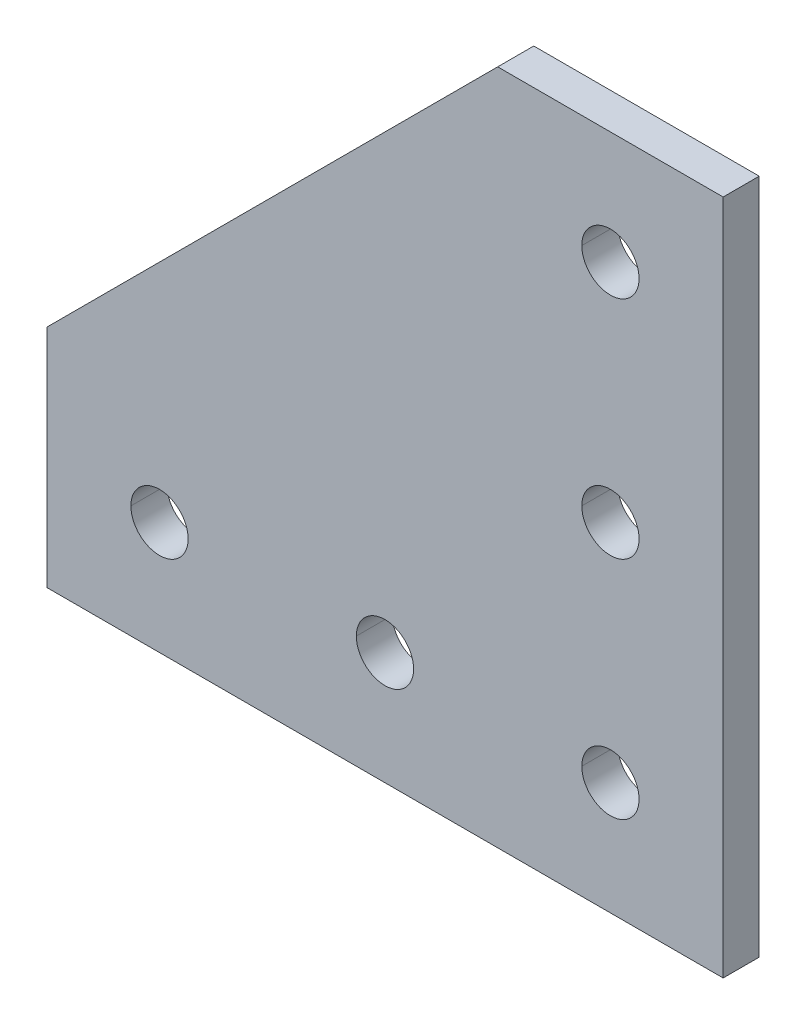
ISO-10303-21;
HEADER;
FILE_DESCRIPTION(('STEP AP214'),'2;1');
FILE_NAME('part.step','',(''),(''),'','','');
FILE_SCHEMA(('AUTOMOTIVE_DESIGN { 1 0 10303 214 1 1 1 1 }'));
ENDSEC;
DATA;
#1=APPLICATION_CONTEXT('core data for automotive mechanical design processes');
#2=APPLICATION_PROTOCOL_DEFINITION('international standard','automotive_design',2000,#1);
#3=PRODUCT_CONTEXT('',#1,'mechanical');
#4=PRODUCT('Part','Part','',(#3));
#5=PRODUCT_RELATED_PRODUCT_CATEGORY('part','',(#4));
#6=PRODUCT_DEFINITION_FORMATION('','',#4);
#7=PRODUCT_DEFINITION_CONTEXT('part definition',#1,'design');
#8=PRODUCT_DEFINITION('design','',#6,#7);
#9=PRODUCT_DEFINITION_SHAPE('','',#8);
#10=(LENGTH_UNIT() NAMED_UNIT(*) SI_UNIT(.MILLI.,.METRE.));
#11=(NAMED_UNIT(*) PLANE_ANGLE_UNIT() SI_UNIT($,.RADIAN.));
#12=(NAMED_UNIT(*) SI_UNIT($,.STERADIAN.) SOLID_ANGLE_UNIT());
#13=UNCERTAINTY_MEASURE_WITH_UNIT(LENGTH_MEASURE(1.E-05),#10,'distance_accuracy_value','');
#14=(GEOMETRIC_REPRESENTATION_CONTEXT(3) GLOBAL_UNCERTAINTY_ASSIGNED_CONTEXT((#13)) GLOBAL_UNIT_ASSIGNED_CONTEXT((#10,
#11,#12)) REPRESENTATION_CONTEXT('',''));
#15=CARTESIAN_POINT('',(0.,0.,0.));
#16=DIRECTION('',(0.,0.,1.));
#17=DIRECTION('',(1.,0.,0.));
#18=AXIS2_PLACEMENT_3D('',#15,#16,#17);
#19=CARTESIAN_POINT('',(37.5,75.,4.));
#20=DIRECTION('',(0.,-1.,0.));
#21=DIRECTION('',(0.,0.,-1.));
#22=AXIS2_PLACEMENT_3D('',#19,#20,#21);
#23=PLANE('',#22);
#24=DIRECTION('',(-1.,0.,0.));
#25=VECTOR('',#24,1.);
#26=CARTESIAN_POINT('',(37.5,75.,0.));
#27=LINE('',#26,#25);
#28=CARTESIAN_POINT('',(37.5,75.,0.));
#29=VERTEX_POINT('',#28);
#30=CARTESIAN_POINT('',(12.5,75.,0.));
#31=VERTEX_POINT('',#30);
#32=EDGE_CURVE('E11',#29,#31,#27,.T.);
#33=ORIENTED_EDGE('',*,*,#32,.T.);
#34=DIRECTION('',(0.,0.,-1.));
#35=VECTOR('',#34,1.);
#36=CARTESIAN_POINT('',(12.5,75.,4.));
#37=LINE('',#36,#35);
#38=CARTESIAN_POINT('',(12.5,75.,4.));
#39=VERTEX_POINT('',#38);
#40=EDGE_CURVE('E25',#39,#31,#37,.T.);
#41=ORIENTED_EDGE('',*,*,#40,.F.);
#42=DIRECTION('',(-1.,0.,0.));
#43=VECTOR('',#42,1.);
#44=CARTESIAN_POINT('',(37.5,75.,4.));
#45=LINE('',#44,#43);
#46=CARTESIAN_POINT('',(37.5,75.,4.));
#47=VERTEX_POINT('',#46);
#48=EDGE_CURVE('E290',#47,#39,#45,.T.);
#49=ORIENTED_EDGE('',*,*,#48,.F.);
#50=DIRECTION('',(0.,0.,-1.));
#51=VECTOR('',#50,1.);
#52=CARTESIAN_POINT('',(37.5,75.,4.));
#53=LINE('',#52,#51);
#54=EDGE_CURVE('E286',#47,#29,#53,.T.);
#55=ORIENTED_EDGE('',*,*,#54,.T.);
#56=EDGE_LOOP('',(#33,#41,#49,#55));
#57=FACE_BOUND('',#56,.T.);
#58=ADVANCED_FACE('F17',(#57),#23,.F.);
#59=CARTESIAN_POINT('',(37.5,0.,4.));
#60=DIRECTION('',(-1.,0.,0.));
#61=DIRECTION('',(0.,0.,1.));
#62=AXIS2_PLACEMENT_3D('',#59,#60,#61);
#63=PLANE('',#62);
#64=DIRECTION('',(0.,1.,0.));
#65=VECTOR('',#64,1.);
#66=CARTESIAN_POINT('',(37.5,0.,0.));
#67=LINE('',#66,#65);
#68=CARTESIAN_POINT('',(37.5,0.,0.));
#69=VERTEX_POINT('',#68);
#70=EDGE_CURVE('E281',#69,#29,#67,.T.);
#71=ORIENTED_EDGE('',*,*,#70,.T.);
#72=ORIENTED_EDGE('',*,*,#54,.F.);
#73=DIRECTION('',(0.,1.,0.));
#74=VECTOR('',#73,1.);
#75=CARTESIAN_POINT('',(37.5,0.,4.));
#76=LINE('',#75,#74);
#77=CARTESIAN_POINT('',(37.5,0.,4.));
#78=VERTEX_POINT('',#77);
#79=EDGE_CURVE('E276',#78,#47,#76,.T.);
#80=ORIENTED_EDGE('',*,*,#79,.F.);
#81=DIRECTION('',(0.,0.,-1.));
#82=VECTOR('',#81,1.);
#83=CARTESIAN_POINT('',(37.5,0.,4.));
#84=LINE('',#83,#82);
#85=EDGE_CURVE('E272',#78,#69,#84,.T.);
#86=ORIENTED_EDGE('',*,*,#85,.T.);
#87=EDGE_LOOP('',(#71,#72,#80,#86));
#88=FACE_BOUND('',#87,.T.);
#89=ADVANCED_FACE('F314',(#88),#63,.F.);
#90=CARTESIAN_POINT('',(-37.5,0.,4.));
#91=DIRECTION('',(0.,1.,0.));
#92=DIRECTION('',(0.,0.,1.));
#93=AXIS2_PLACEMENT_3D('',#90,#91,#92);
#94=PLANE('',#93);
#95=DIRECTION('',(1.,0.,0.));
#96=VECTOR('',#95,1.);
#97=CARTESIAN_POINT('',(-37.5,0.,0.));
#98=LINE('',#97,#96);
#99=CARTESIAN_POINT('',(-37.5,0.,0.));
#100=VERTEX_POINT('',#99);
#101=EDGE_CURVE('E267',#100,#69,#98,.T.);
#102=ORIENTED_EDGE('',*,*,#101,.T.);
#103=ORIENTED_EDGE('',*,*,#85,.F.);
#104=DIRECTION('',(1.,0.,0.));
#105=VECTOR('',#104,1.);
#106=CARTESIAN_POINT('',(-37.5,0.,4.));
#107=LINE('',#106,#105);
#108=CARTESIAN_POINT('',(-37.5,0.,4.));
#109=VERTEX_POINT('',#108);
#110=EDGE_CURVE('E262',#109,#78,#107,.T.);
#111=ORIENTED_EDGE('',*,*,#110,.F.);
#112=DIRECTION('',(0.,0.,-1.));
#113=VECTOR('',#112,1.);
#114=CARTESIAN_POINT('',(-37.5,0.,4.));
#115=LINE('',#114,#113);
#116=EDGE_CURVE('E258',#109,#100,#115,.T.);
#117=ORIENTED_EDGE('',*,*,#116,.T.);
#118=EDGE_LOOP('',(#102,#103,#111,#117));
#119=FACE_BOUND('',#118,.T.);
#120=ADVANCED_FACE('F317',(#119),#94,.F.);
#121=CARTESIAN_POINT('',(-37.5,25.,4.));
#122=DIRECTION('',(1.,0.,0.));
#123=DIRECTION('',(0.,0.,-1.));
#124=AXIS2_PLACEMENT_3D('',#121,#122,#123);
#125=PLANE('',#124);
#126=DIRECTION('',(0.,-1.,0.));
#127=VECTOR('',#126,1.);
#128=CARTESIAN_POINT('',(-37.5,25.,0.));
#129=LINE('',#128,#127);
#130=CARTESIAN_POINT('',(-37.5,25.,0.));
#131=VERTEX_POINT('',#130);
#132=EDGE_CURVE('E253',#131,#100,#129,.T.);
#133=ORIENTED_EDGE('',*,*,#132,.T.);
#134=ORIENTED_EDGE('',*,*,#116,.F.);
#135=DIRECTION('',(0.,-1.,0.));
#136=VECTOR('',#135,1.);
#137=CARTESIAN_POINT('',(-37.5,25.,4.));
#138=LINE('',#137,#136);
#139=CARTESIAN_POINT('',(-37.5,25.,4.));
#140=VERTEX_POINT('',#139);
#141=EDGE_CURVE('E248',#140,#109,#138,.T.);
#142=ORIENTED_EDGE('',*,*,#141,.F.);
#143=DIRECTION('',(0.,0.,-1.));
#144=VECTOR('',#143,1.);
#145=CARTESIAN_POINT('',(-37.5,25.,4.));
#146=LINE('',#145,#144);
#147=EDGE_CURVE('E244',#140,#131,#146,.T.);
#148=ORIENTED_EDGE('',*,*,#147,.T.);
#149=EDGE_LOOP('',(#133,#134,#142,#148));
#150=FACE_BOUND('',#149,.T.);
#151=ADVANCED_FACE('F309',(#150),#125,.F.);
#152=CARTESIAN_POINT('',(12.5,75.,4.));
#153=DIRECTION('',(0.707106781186547,-0.707106781186548,0.));
#154=DIRECTION('',(0.707106781186548,0.707106781186547,0.));
#155=AXIS2_PLACEMENT_3D('',#152,#153,#154);
#156=PLANE('',#155);
#157=DIRECTION('',(-0.707106781186548,-0.707106781186547,0.));
#158=VECTOR('',#157,1.);
#159=CARTESIAN_POINT('',(12.5,75.,0.));
#160=LINE('',#159,#158);
#161=EDGE_CURVE('E239',#31,#131,#160,.T.);
#162=ORIENTED_EDGE('',*,*,#161,.T.);
#163=ORIENTED_EDGE('',*,*,#147,.F.);
#164=DIRECTION('',(-0.707106781186548,-0.707106781186547,0.));
#165=VECTOR('',#164,1.);
#166=CARTESIAN_POINT('',(12.5,75.,4.));
#167=LINE('',#166,#165);
#168=EDGE_CURVE('E234',#39,#140,#167,.T.);
#169=ORIENTED_EDGE('',*,*,#168,.F.);
#170=ORIENTED_EDGE('',*,*,#40,.T.);
#171=EDGE_LOOP('',(#162,#163,#169,#170));
#172=FACE_BOUND('',#171,.T.);
#173=ADVANCED_FACE('F301',(#172),#156,.F.);
#174=CARTESIAN_POINT('',(0.,0.,4.));
#175=DIRECTION('',(0.,0.,1.));
#176=DIRECTION('',(1.,0.,0.));
#177=AXIS2_PLACEMENT_3D('',#174,#175,#176);
#178=PLANE('',#177);
#179=CARTESIAN_POINT('',(-25.,12.5,4.));
#180=DIRECTION('',(0.,0.,1.));
#181=DIRECTION('',(1.,0.,0.));
#182=AXIS2_PLACEMENT_3D('',#179,#180,#181);
#183=CIRCLE('',#182,3.175);
#184=CARTESIAN_POINT('',(-21.825,12.5,4.));
#185=VERTEX_POINT('',#184);
#186=CARTESIAN_POINT('',(-28.175,12.5,4.));
#187=VERTEX_POINT('',#186);
#188=EDGE_CURVE('E229',#185,#187,#183,.T.);
#189=ORIENTED_EDGE('',*,*,#188,.F.);
#190=CARTESIAN_POINT('',(-25.,12.5,4.));
#191=DIRECTION('',(0.,0.,1.));
#192=DIRECTION('',(1.,0.,0.));
#193=AXIS2_PLACEMENT_3D('',#190,#191,#192);
#194=CIRCLE('',#193,3.175);
#195=EDGE_CURVE('E224',#187,#185,#194,.T.);
#196=ORIENTED_EDGE('',*,*,#195,.F.);
#197=EDGE_LOOP('',(#189,#196));
#198=FACE_BOUND('',#197,.T.);
#199=CARTESIAN_POINT('',(0.,12.5,4.));
#200=DIRECTION('',(0.,0.,1.));
#201=DIRECTION('',(1.,0.,0.));
#202=AXIS2_PLACEMENT_3D('',#199,#200,#201);
#203=CIRCLE('',#202,3.175);
#204=CARTESIAN_POINT('',(3.175,12.5,4.));
#205=VERTEX_POINT('',#204);
#206=CARTESIAN_POINT('',(-3.175,12.5,4.));
#207=VERTEX_POINT('',#206);
#208=EDGE_CURVE('E219',#205,#207,#203,.T.);
#209=ORIENTED_EDGE('',*,*,#208,.F.);
#210=CARTESIAN_POINT('',(0.,12.5,4.));
#211=DIRECTION('',(0.,0.,1.));
#212=DIRECTION('',(1.,0.,0.));
#213=AXIS2_PLACEMENT_3D('',#210,#211,#212);
#214=CIRCLE('',#213,3.175);
#215=EDGE_CURVE('E214',#207,#205,#214,.T.);
#216=ORIENTED_EDGE('',*,*,#215,.F.);
#217=EDGE_LOOP('',(#209,#216));
#218=FACE_BOUND('',#217,.T.);
#219=CARTESIAN_POINT('',(25.,62.5,4.));
#220=DIRECTION('',(0.,0.,1.));
#221=DIRECTION('',(1.,0.,0.));
#222=AXIS2_PLACEMENT_3D('',#219,#220,#221);
#223=CIRCLE('',#222,3.175);
#224=CARTESIAN_POINT('',(28.175,62.5,4.));
#225=VERTEX_POINT('',#224);
#226=CARTESIAN_POINT('',(21.825,62.5,4.));
#227=VERTEX_POINT('',#226);
#228=EDGE_CURVE('E209',#225,#227,#223,.T.);
#229=ORIENTED_EDGE('',*,*,#228,.F.);
#230=CARTESIAN_POINT('',(25.,62.5,4.));
#231=DIRECTION('',(0.,0.,1.));
#232=DIRECTION('',(1.,0.,0.));
#233=AXIS2_PLACEMENT_3D('',#230,#231,#232);
#234=CIRCLE('',#233,3.175);
#235=EDGE_CURVE('E204',#227,#225,#234,.T.);
#236=ORIENTED_EDGE('',*,*,#235,.F.);
#237=EDGE_LOOP('',(#229,#236));
#238=FACE_BOUND('',#237,.T.);
#239=CARTESIAN_POINT('',(25.,37.5,4.));
#240=DIRECTION('',(0.,0.,1.));
#241=DIRECTION('',(1.,0.,0.));
#242=AXIS2_PLACEMENT_3D('',#239,#240,#241);
#243=CIRCLE('',#242,3.175);
#244=CARTESIAN_POINT('',(28.175,37.5,4.));
#245=VERTEX_POINT('',#244);
#246=CARTESIAN_POINT('',(21.825,37.5,4.));
#247=VERTEX_POINT('',#246);
#248=EDGE_CURVE('E200',#245,#247,#243,.T.);
#249=ORIENTED_EDGE('',*,*,#248,.F.);
#250=CARTESIAN_POINT('',(25.,37.5,4.));
#251=DIRECTION('',(0.,0.,1.));
#252=DIRECTION('',(1.,0.,0.));
#253=AXIS2_PLACEMENT_3D('',#250,#251,#252);
#254=CIRCLE('',#253,3.175);
#255=EDGE_CURVE('E133',#247,#245,#254,.T.);
#256=ORIENTED_EDGE('',*,*,#255,.F.);
#257=EDGE_LOOP('',(#249,#256));
#258=FACE_BOUND('',#257,.T.);
#259=CARTESIAN_POINT('',(25.,12.5,4.));
#260=DIRECTION('',(0.,0.,1.));
#261=DIRECTION('',(1.,0.,0.));
#262=AXIS2_PLACEMENT_3D('',#259,#260,#261);
#263=CIRCLE('',#262,3.175);
#264=CARTESIAN_POINT('',(28.175,12.5,4.));
#265=VERTEX_POINT('',#264);
#266=CARTESIAN_POINT('',(21.825,12.5,4.));
#267=VERTEX_POINT('',#266);
#268=EDGE_CURVE('E192',#265,#267,#263,.T.);
#269=ORIENTED_EDGE('',*,*,#268,.F.);
#270=CARTESIAN_POINT('',(25.,12.5,4.));
#271=DIRECTION('',(0.,0.,1.));
#272=DIRECTION('',(1.,0.,0.));
#273=AXIS2_PLACEMENT_3D('',#270,#271,#272);
#274=CIRCLE('',#273,3.175);
#275=EDGE_CURVE('E187',#267,#265,#274,.T.);
#276=ORIENTED_EDGE('',*,*,#275,.F.);
#277=EDGE_LOOP('',(#269,#276));
#278=FACE_BOUND('',#277,.T.);
#279=ORIENTED_EDGE('',*,*,#168,.T.);
#280=ORIENTED_EDGE('',*,*,#141,.T.);
#281=ORIENTED_EDGE('',*,*,#110,.T.);
#282=ORIENTED_EDGE('',*,*,#79,.T.);
#283=ORIENTED_EDGE('',*,*,#48,.T.);
#284=EDGE_LOOP('',(#279,#280,#281,#282,#283));
#285=FACE_BOUND('',#284,.T.);
#286=ADVANCED_FACE('F311',(#198,#218,#238,#258,#278,#285),#178,.T.);
#287=CARTESIAN_POINT('',(25.,12.5,4.));
#288=DIRECTION('',(0.,0.,1.));
#289=DIRECTION('',(0.,1.,0.));
#290=AXIS2_PLACEMENT_3D('',#287,#288,#289);
#291=CYLINDRICAL_SURFACE('',#290,3.175);
#292=CARTESIAN_POINT('',(25.,12.5,0.));
#293=DIRECTION('',(0.,0.,1.));
#294=DIRECTION('',(1.,0.,0.));
#295=AXIS2_PLACEMENT_3D('',#292,#293,#294);
#296=CIRCLE('',#295,3.175);
#297=CARTESIAN_POINT('',(21.825,12.5,0.));
#298=VERTEX_POINT('',#297);
#299=CARTESIAN_POINT('',(28.175,12.5,0.));
#300=VERTEX_POINT('',#299);
#301=EDGE_CURVE('E182',#298,#300,#296,.T.);
#302=ORIENTED_EDGE('',*,*,#301,.F.);
#303=DIRECTION('',(0.,0.,1.));
#304=VECTOR('',#303,1.);
#305=CARTESIAN_POINT('',(21.825,12.5,0.));
#306=LINE('',#305,#304);
#307=EDGE_CURVE('E177',#298,#267,#306,.T.);
#308=ORIENTED_EDGE('',*,*,#307,.T.);
#309=ORIENTED_EDGE('',*,*,#275,.T.);
#310=DIRECTION('',(0.,0.,1.));
#311=VECTOR('',#310,1.);
#312=CARTESIAN_POINT('',(28.175,12.5,0.));
#313=LINE('',#312,#311);
#314=EDGE_CURVE('E172',#300,#265,#313,.T.);
#315=ORIENTED_EDGE('',*,*,#314,.F.);
#316=EDGE_LOOP('',(#302,#308,#309,#315));
#317=FACE_BOUND('',#316,.T.);
#318=ADVANCED_FACE('F364',(#317),#291,.F.);
#319=CARTESIAN_POINT('',(25.,12.5,4.));
#320=DIRECTION('',(0.,0.,1.));
#321=DIRECTION('',(0.,-1.,0.));
#322=AXIS2_PLACEMENT_3D('',#319,#320,#321);
#323=CYLINDRICAL_SURFACE('',#322,3.175);
#324=ORIENTED_EDGE('',*,*,#268,.T.);
#325=ORIENTED_EDGE('',*,*,#307,.F.);
#326=CARTESIAN_POINT('',(25.,12.5,0.));
#327=DIRECTION('',(0.,0.,1.));
#328=DIRECTION('',(1.,0.,0.));
#329=AXIS2_PLACEMENT_3D('',#326,#327,#328);
#330=CIRCLE('',#329,3.175);
#331=EDGE_CURVE('E167',#300,#298,#330,.T.);
#332=ORIENTED_EDGE('',*,*,#331,.F.);
#333=ORIENTED_EDGE('',*,*,#314,.T.);
#334=EDGE_LOOP('',(#324,#325,#332,#333));
#335=FACE_BOUND('',#334,.T.);
#336=ADVANCED_FACE('F374',(#335),#323,.F.);
#337=CARTESIAN_POINT('',(0.,0.,0.));
#338=DIRECTION('',(0.,0.,1.));
#339=DIRECTION('',(1.,0.,0.));
#340=AXIS2_PLACEMENT_3D('',#337,#338,#339);
#341=PLANE('',#340);
#342=CARTESIAN_POINT('',(-25.,12.5,0.));
#343=DIRECTION('',(0.,0.,1.));
#344=DIRECTION('',(1.,0.,0.));
#345=AXIS2_PLACEMENT_3D('',#342,#343,#344);
#346=CIRCLE('',#345,3.175);
#347=CARTESIAN_POINT('',(-21.825,12.5,0.));
#348=VERTEX_POINT('',#347);
#349=CARTESIAN_POINT('',(-28.175,12.5,0.));
#350=VERTEX_POINT('',#349);
#351=EDGE_CURVE('E163',#348,#350,#346,.T.);
#352=ORIENTED_EDGE('',*,*,#351,.T.);
#353=CARTESIAN_POINT('',(-25.,12.5,0.));
#354=DIRECTION('',(0.,0.,1.));
#355=DIRECTION('',(1.,0.,0.));
#356=AXIS2_PLACEMENT_3D('',#353,#354,#355);
#357=CIRCLE('',#356,3.175);
#358=EDGE_CURVE('E159',#350,#348,#357,.T.);
#359=ORIENTED_EDGE('',*,*,#358,.T.);
#360=EDGE_LOOP('',(#352,#359));
#361=FACE_BOUND('',#360,.T.);
#362=CARTESIAN_POINT('',(0.,12.5,0.));
#363=DIRECTION('',(0.,0.,1.));
#364=DIRECTION('',(1.,0.,0.));
#365=AXIS2_PLACEMENT_3D('',#362,#363,#364);
#366=CIRCLE('',#365,3.175);
#367=CARTESIAN_POINT('',(3.175,12.5,0.));
#368=VERTEX_POINT('',#367);
#369=CARTESIAN_POINT('',(-3.175,12.5,0.));
#370=VERTEX_POINT('',#369);
#371=EDGE_CURVE('E155',#368,#370,#366,.T.);
#372=ORIENTED_EDGE('',*,*,#371,.T.);
#373=CARTESIAN_POINT('',(0.,12.5,0.));
#374=DIRECTION('',(0.,0.,1.));
#375=DIRECTION('',(1.,0.,0.));
#376=AXIS2_PLACEMENT_3D('',#373,#374,#375);
#377=CIRCLE('',#376,3.175);
#378=EDGE_CURVE('E151',#370,#368,#377,.T.);
#379=ORIENTED_EDGE('',*,*,#378,.T.);
#380=EDGE_LOOP('',(#372,#379));
#381=FACE_BOUND('',#380,.T.);
#382=CARTESIAN_POINT('',(25.,62.5,0.));
#383=DIRECTION('',(0.,0.,1.));
#384=DIRECTION('',(1.,0.,0.));
#385=AXIS2_PLACEMENT_3D('',#382,#383,#384);
#386=CIRCLE('',#385,3.175);
#387=CARTESIAN_POINT('',(28.175,62.5,0.));
#388=VERTEX_POINT('',#387);
#389=CARTESIAN_POINT('',(21.825,62.5,0.));
#390=VERTEX_POINT('',#389);
#391=EDGE_CURVE('E141',#388,#390,#386,.T.);
#392=ORIENTED_EDGE('',*,*,#391,.T.);
#393=CARTESIAN_POINT('',(25.,62.5,0.));
#394=DIRECTION('',(0.,0.,1.));
#395=DIRECTION('',(1.,0.,0.));
#396=AXIS2_PLACEMENT_3D('',#393,#394,#395);
#397=CIRCLE('',#396,3.175);
#398=EDGE_CURVE('E139',#390,#388,#397,.T.);
#399=ORIENTED_EDGE('',*,*,#398,.T.);
#400=EDGE_LOOP('',(#392,#399));
#401=FACE_BOUND('',#400,.T.);
#402=CARTESIAN_POINT('',(25.,37.5,0.));
#403=DIRECTION('',(0.,0.,1.));
#404=DIRECTION('',(1.,0.,0.));
#405=AXIS2_PLACEMENT_3D('',#402,#403,#404);
#406=CIRCLE('',#405,3.175);
#407=CARTESIAN_POINT('',(28.175,37.5,0.));
#408=VERTEX_POINT('',#407);
#409=CARTESIAN_POINT('',(21.825,37.5,0.));
#410=VERTEX_POINT('',#409);
#411=EDGE_CURVE('E123',#408,#410,#406,.T.);
#412=ORIENTED_EDGE('',*,*,#411,.T.);
#413=CARTESIAN_POINT('',(25.,37.5,0.));
#414=DIRECTION('',(0.,0.,1.));
#415=DIRECTION('',(1.,0.,0.));
#416=AXIS2_PLACEMENT_3D('',#413,#414,#415);
#417=CIRCLE('',#416,3.175);
#418=EDGE_CURVE('E118',#410,#408,#417,.T.);
#419=ORIENTED_EDGE('',*,*,#418,.T.);
#420=EDGE_LOOP('',(#412,#419));
#421=FACE_BOUND('',#420,.T.);
#422=ORIENTED_EDGE('',*,*,#331,.T.);
#423=ORIENTED_EDGE('',*,*,#301,.T.);
#424=EDGE_LOOP('',(#422,#423));
#425=FACE_BOUND('',#424,.T.);
#426=ORIENTED_EDGE('',*,*,#161,.F.);
#427=ORIENTED_EDGE('',*,*,#32,.F.);
#428=ORIENTED_EDGE('',*,*,#70,.F.);
#429=ORIENTED_EDGE('',*,*,#101,.F.);
#430=ORIENTED_EDGE('',*,*,#132,.F.);
#431=EDGE_LOOP('',(#426,#427,#428,#429,#430));
#432=FACE_BOUND('',#431,.T.);
#433=ADVANCED_FACE('F120',(#361,#381,#401,#421,#425,#432),#341,.F.);
#434=CARTESIAN_POINT('',(25.,37.5,4.));
#435=DIRECTION('',(0.,0.,1.));
#436=DIRECTION('',(0.,1.,0.));
#437=AXIS2_PLACEMENT_3D('',#434,#435,#436);
#438=CYLINDRICAL_SURFACE('',#437,3.175);
#439=ORIENTED_EDGE('',*,*,#418,.F.);
#440=DIRECTION('',(0.,0.,1.));
#441=VECTOR('',#440,1.);
#442=CARTESIAN_POINT('',(21.825,37.5,0.));
#443=LINE('',#442,#441);
#444=EDGE_CURVE('E127',#410,#247,#443,.T.);
#445=ORIENTED_EDGE('',*,*,#444,.T.);
#446=ORIENTED_EDGE('',*,*,#255,.T.);
#447=DIRECTION('',(0.,0.,1.));
#448=VECTOR('',#447,1.);
#449=CARTESIAN_POINT('',(28.175,37.5,0.));
#450=LINE('',#449,#448);
#451=EDGE_CURVE('E131',#408,#245,#450,.T.);
#452=ORIENTED_EDGE('',*,*,#451,.F.);
#453=EDGE_LOOP('',(#439,#445,#446,#452));
#454=FACE_BOUND('',#453,.T.);
#455=ADVANCED_FACE('F132',(#454),#438,.F.);
#456=CARTESIAN_POINT('',(25.,37.5,4.));
#457=DIRECTION('',(0.,0.,1.));
#458=DIRECTION('',(0.,-1.,0.));
#459=AXIS2_PLACEMENT_3D('',#456,#457,#458);
#460=CYLINDRICAL_SURFACE('',#459,3.175);
#461=ORIENTED_EDGE('',*,*,#248,.T.);
#462=ORIENTED_EDGE('',*,*,#444,.F.);
#463=ORIENTED_EDGE('',*,*,#411,.F.);
#464=ORIENTED_EDGE('',*,*,#451,.T.);
#465=EDGE_LOOP('',(#461,#462,#463,#464));
#466=FACE_BOUND('',#465,.T.);
#467=ADVANCED_FACE('F138',(#466),#460,.F.);
#468=CARTESIAN_POINT('',(25.,62.5,4.));
#469=DIRECTION('',(0.,0.,1.));
#470=DIRECTION('',(0.,1.,0.));
#471=AXIS2_PLACEMENT_3D('',#468,#469,#470);
#472=CYLINDRICAL_SURFACE('',#471,3.175);
#473=ORIENTED_EDGE('',*,*,#398,.F.);
#474=DIRECTION('',(0.,0.,1.));
#475=VECTOR('',#474,1.);
#476=CARTESIAN_POINT('',(21.825,62.5,0.));
#477=LINE('',#476,#475);
#478=EDGE_CURVE('E136',#390,#227,#477,.T.);
#479=ORIENTED_EDGE('',*,*,#478,.T.);
#480=ORIENTED_EDGE('',*,*,#235,.T.);
#481=DIRECTION('',(0.,0.,1.));
#482=VECTOR('',#481,1.);
#483=CARTESIAN_POINT('',(28.175,62.5,0.));
#484=LINE('',#483,#482);
#485=EDGE_CURVE('E538',#388,#225,#484,.T.);
#486=ORIENTED_EDGE('',*,*,#485,.F.);
#487=EDGE_LOOP('',(#473,#479,#480,#486));
#488=FACE_BOUND('',#487,.T.);
#489=ADVANCED_FACE('F410',(#488),#472,.F.);
#490=CARTESIAN_POINT('',(25.,62.5,4.));
#491=DIRECTION('',(0.,0.,1.));
#492=DIRECTION('',(0.,-1.,0.));
#493=AXIS2_PLACEMENT_3D('',#490,#491,#492);
#494=CYLINDRICAL_SURFACE('',#493,3.175);
#495=ORIENTED_EDGE('',*,*,#228,.T.);
#496=ORIENTED_EDGE('',*,*,#478,.F.);
#497=ORIENTED_EDGE('',*,*,#391,.F.);
#498=ORIENTED_EDGE('',*,*,#485,.T.);
#499=EDGE_LOOP('',(#495,#496,#497,#498));
#500=FACE_BOUND('',#499,.T.);
#501=ADVANCED_FACE('F419',(#500),#494,.F.);
#502=CARTESIAN_POINT('',(0.,12.5,4.));
#503=DIRECTION('',(0.,0.,1.));
#504=DIRECTION('',(0.,1.,0.));
#505=AXIS2_PLACEMENT_3D('',#502,#503,#504);
#506=CYLINDRICAL_SURFACE('',#505,3.175);
#507=ORIENTED_EDGE('',*,*,#378,.F.);
#508=DIRECTION('',(0.,0.,1.));
#509=VECTOR('',#508,1.);
#510=CARTESIAN_POINT('',(-3.175,12.5,0.));
#511=LINE('',#510,#509);
#512=EDGE_CURVE('E526',#370,#207,#511,.T.);
#513=ORIENTED_EDGE('',*,*,#512,.T.);
#514=ORIENTED_EDGE('',*,*,#215,.T.);
#515=DIRECTION('',(0.,0.,1.));
#516=VECTOR('',#515,1.);
#517=CARTESIAN_POINT('',(3.175,12.5,0.));
#518=LINE('',#517,#516);
#519=EDGE_CURVE('E523',#368,#205,#518,.T.);
#520=ORIENTED_EDGE('',*,*,#519,.F.);
#521=EDGE_LOOP('',(#507,#513,#514,#520));
#522=FACE_BOUND('',#521,.T.);
#523=ADVANCED_FACE('F429',(#522),#506,.F.);
#524=CARTESIAN_POINT('',(0.,12.5,4.));
#525=DIRECTION('',(0.,0.,1.));
#526=DIRECTION('',(0.,-1.,0.));
#527=AXIS2_PLACEMENT_3D('',#524,#525,#526);
#528=CYLINDRICAL_SURFACE('',#527,3.175);
#529=ORIENTED_EDGE('',*,*,#208,.T.);
#530=ORIENTED_EDGE('',*,*,#512,.F.);
#531=ORIENTED_EDGE('',*,*,#371,.F.);
#532=ORIENTED_EDGE('',*,*,#519,.T.);
#533=EDGE_LOOP('',(#529,#530,#531,#532));
#534=FACE_BOUND('',#533,.T.);
#535=ADVANCED_FACE('F439',(#534),#528,.F.);
#536=CARTESIAN_POINT('',(-25.,12.5,4.));
#537=DIRECTION('',(0.,0.,1.));
#538=DIRECTION('',(0.,1.,0.));
#539=AXIS2_PLACEMENT_3D('',#536,#537,#538);
#540=CYLINDRICAL_SURFACE('',#539,3.175);
#541=ORIENTED_EDGE('',*,*,#358,.F.);
#542=DIRECTION('',(0.,0.,1.));
#543=VECTOR('',#542,1.);
#544=CARTESIAN_POINT('',(-28.175,12.5,0.));
#545=LINE('',#544,#543);
#546=EDGE_CURVE('E518',#350,#187,#545,.T.);
#547=ORIENTED_EDGE('',*,*,#546,.T.);
#548=ORIENTED_EDGE('',*,*,#195,.T.);
#549=DIRECTION('',(0.,0.,1.));
#550=VECTOR('',#549,1.);
#551=CARTESIAN_POINT('',(-21.825,12.5,0.));
#552=LINE('',#551,#550);
#553=EDGE_CURVE('E520',#348,#185,#552,.T.);
#554=ORIENTED_EDGE('',*,*,#553,.F.);
#555=EDGE_LOOP('',(#541,#547,#548,#554));
#556=FACE_BOUND('',#555,.T.);
#557=ADVANCED_FACE('F449',(#556),#540,.F.);
#558=CARTESIAN_POINT('',(-25.,12.5,4.));
#559=DIRECTION('',(0.,0.,1.));
#560=DIRECTION('',(0.,-1.,0.));
#561=AXIS2_PLACEMENT_3D('',#558,#559,#560);
#562=CYLINDRICAL_SURFACE('',#561,3.175);
#563=ORIENTED_EDGE('',*,*,#188,.T.);
#564=ORIENTED_EDGE('',*,*,#546,.F.);
#565=ORIENTED_EDGE('',*,*,#351,.F.);
#566=ORIENTED_EDGE('',*,*,#553,.T.);
#567=EDGE_LOOP('',(#563,#564,#565,#566));
#568=FACE_BOUND('',#567,.T.);
#569=ADVANCED_FACE('F459',(#568),#562,.F.);
#570=CLOSED_SHELL('',(#58,#89,#120,#151,#173,#286,#318,#336,#433,#455,#467,#489,#501,#523,#535,
#557,#569));
#571=MANIFOLD_SOLID_BREP('B1',#570);
#572=ADVANCED_BREP_SHAPE_REPRESENTATION('',(#18,#571),#14);
#573=SHAPE_DEFINITION_REPRESENTATION(#9,#572);
ENDSEC;
END-ISO-10303-21;
